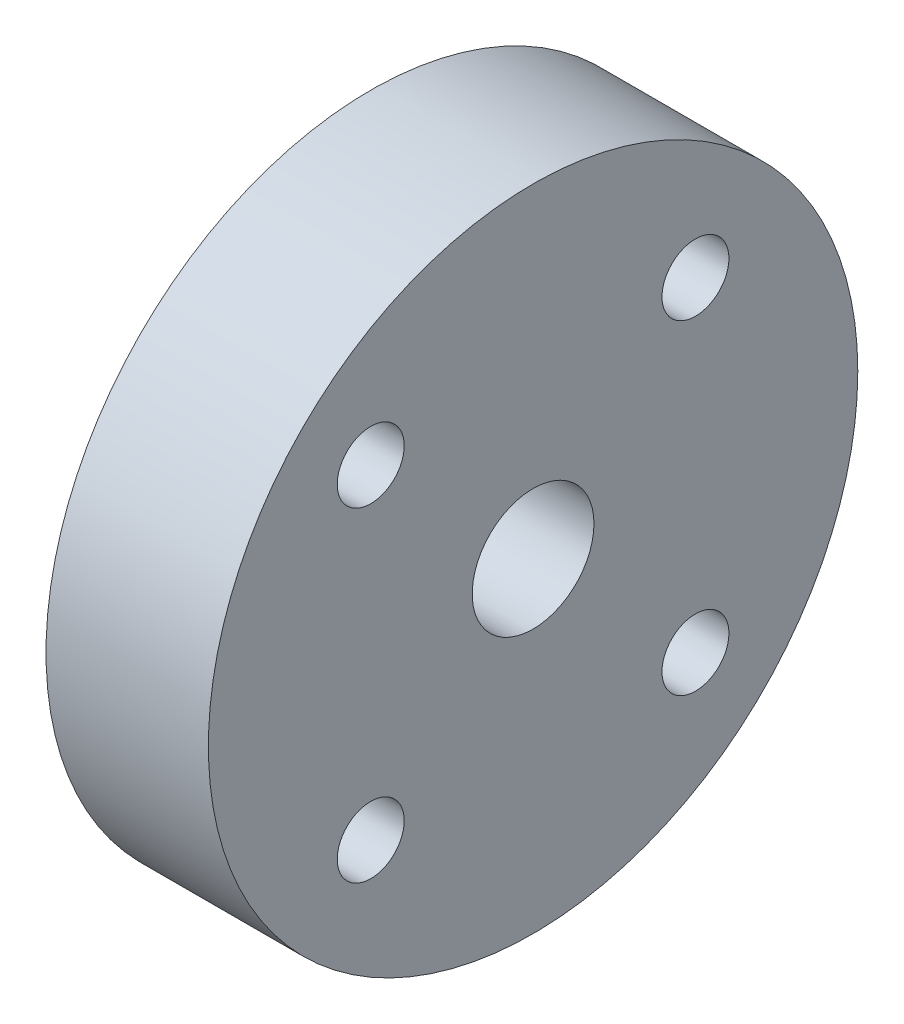
ISO-10303-21;
HEADER;
FILE_DESCRIPTION(('STEP AP214'),'2;1');
FILE_NAME('part.step','',(''),(''),'','','');
FILE_SCHEMA(('AUTOMOTIVE_DESIGN { 1 0 10303 214 1 1 1 1 }'));
ENDSEC;
DATA;
#1=APPLICATION_CONTEXT('core data for automotive mechanical design processes');
#2=APPLICATION_PROTOCOL_DEFINITION('international standard','automotive_design',2000,#1);
#3=PRODUCT_CONTEXT('',#1,'mechanical');
#4=PRODUCT('Part','Part','',(#3));
#5=PRODUCT_RELATED_PRODUCT_CATEGORY('part','',(#4));
#6=PRODUCT_DEFINITION_FORMATION('','',#4);
#7=PRODUCT_DEFINITION_CONTEXT('part definition',#1,'design');
#8=PRODUCT_DEFINITION('design','',#6,#7);
#9=PRODUCT_DEFINITION_SHAPE('','',#8);
#10=(LENGTH_UNIT() NAMED_UNIT(*) SI_UNIT(.MILLI.,.METRE.));
#11=(NAMED_UNIT(*) PLANE_ANGLE_UNIT() SI_UNIT($,.RADIAN.));
#12=(NAMED_UNIT(*) SI_UNIT($,.STERADIAN.) SOLID_ANGLE_UNIT());
#13=UNCERTAINTY_MEASURE_WITH_UNIT(LENGTH_MEASURE(1.E-05),#10,'distance_accuracy_value','');
#14=(GEOMETRIC_REPRESENTATION_CONTEXT(3) GLOBAL_UNCERTAINTY_ASSIGNED_CONTEXT((#13)) GLOBAL_UNIT_ASSIGNED_CONTEXT((#10,
#11,#12)) REPRESENTATION_CONTEXT('',''));
#15=CARTESIAN_POINT('',(0.,0.,0.));
#16=DIRECTION('',(0.,0.,1.));
#17=DIRECTION('',(1.,0.,0.));
#18=AXIS2_PLACEMENT_3D('',#15,#16,#17);
#19=CARTESIAN_POINT('',(8.,0.,0.));
#20=DIRECTION('',(-1.,0.,0.));
#21=DIRECTION('',(0.,0.,1.));
#22=AXIS2_PLACEMENT_3D('',#19,#20,#21);
#23=CYLINDRICAL_SURFACE('',#22,16.);
#24=CARTESIAN_POINT('',(8.,0.,0.));
#25=DIRECTION('',(1.,0.,0.));
#26=DIRECTION('',(0.,0.,-1.));
#27=AXIS2_PLACEMENT_3D('',#24,#25,#26);
#28=CIRCLE('',#27,16.);
#29=CARTESIAN_POINT('',(8.,0.,-16.));
#30=VERTEX_POINT('',#29);
#31=EDGE_CURVE('E10',#30,#30,#28,.T.);
#32=ORIENTED_EDGE('',*,*,#31,.F.);
#33=EDGE_LOOP('',(#32));
#34=FACE_BOUND('',#33,.T.);
#35=CARTESIAN_POINT('',(0.,0.,0.));
#36=DIRECTION('',(1.,0.,0.));
#37=DIRECTION('',(0.,0.,-1.));
#38=AXIS2_PLACEMENT_3D('',#35,#36,#37);
#39=CIRCLE('',#38,16.);
#40=CARTESIAN_POINT('',(0.,0.,-16.));
#41=VERTEX_POINT('',#40);
#42=EDGE_CURVE('E37',#41,#41,#39,.T.);
#43=ORIENTED_EDGE('',*,*,#42,.T.);
#44=EDGE_LOOP('',(#43));
#45=FACE_BOUND('',#44,.T.);
#46=ADVANCED_FACE('F40',(#34,#45),#23,.T.);
#47=CARTESIAN_POINT('',(8.,0.,0.));
#48=DIRECTION('',(1.,0.,0.));
#49=DIRECTION('',(0.,0.,-1.));
#50=AXIS2_PLACEMENT_3D('',#47,#48,#49);
#51=PLANE('',#50);
#52=CARTESIAN_POINT('',(8.,-8.,8.));
#53=DIRECTION('',(1.,0.,0.));
#54=DIRECTION('',(0.,0.,-1.));
#55=AXIS2_PLACEMENT_3D('',#52,#53,#54);
#56=CIRCLE('',#55,1.65);
#57=CARTESIAN_POINT('',(8.,-8.,6.35));
#58=VERTEX_POINT('',#57);
#59=EDGE_CURVE('E59',#58,#58,#56,.T.);
#60=ORIENTED_EDGE('',*,*,#59,.F.);
#61=EDGE_LOOP('',(#60));
#62=FACE_BOUND('',#61,.T.);
#63=CARTESIAN_POINT('',(8.,8.,-8.));
#64=DIRECTION('',(1.,0.,0.));
#65=DIRECTION('',(0.,0.,-1.));
#66=AXIS2_PLACEMENT_3D('',#63,#64,#65);
#67=CIRCLE('',#66,1.65);
#68=CARTESIAN_POINT('',(8.,8.,-9.65));
#69=VERTEX_POINT('',#68);
#70=EDGE_CURVE('E62',#69,#69,#67,.T.);
#71=ORIENTED_EDGE('',*,*,#70,.F.);
#72=EDGE_LOOP('',(#71));
#73=FACE_BOUND('',#72,.T.);
#74=CARTESIAN_POINT('',(8.,-8.,-8.));
#75=DIRECTION('',(1.,0.,0.));
#76=DIRECTION('',(0.,0.,-1.));
#77=AXIS2_PLACEMENT_3D('',#74,#75,#76);
#78=CIRCLE('',#77,1.65);
#79=CARTESIAN_POINT('',(8.,-8.,-9.65));
#80=VERTEX_POINT('',#79);
#81=EDGE_CURVE('E64',#80,#80,#78,.T.);
#82=ORIENTED_EDGE('',*,*,#81,.F.);
#83=EDGE_LOOP('',(#82));
#84=FACE_BOUND('',#83,.T.);
#85=CARTESIAN_POINT('',(8.,8.,8.));
#86=DIRECTION('',(1.,0.,0.));
#87=DIRECTION('',(0.,0.,-1.));
#88=AXIS2_PLACEMENT_3D('',#85,#86,#87);
#89=CIRCLE('',#88,1.65);
#90=CARTESIAN_POINT('',(8.,8.,6.35));
#91=VERTEX_POINT('',#90);
#92=EDGE_CURVE('E54',#91,#91,#89,.T.);
#93=ORIENTED_EDGE('',*,*,#92,.F.);
#94=EDGE_LOOP('',(#93));
#95=FACE_BOUND('',#94,.T.);
#96=CARTESIAN_POINT('',(8.,0.,0.));
#97=DIRECTION('',(1.,0.,0.));
#98=DIRECTION('',(0.,0.,-1.));
#99=AXIS2_PLACEMENT_3D('',#96,#97,#98);
#100=CIRCLE('',#99,3.);
#101=CARTESIAN_POINT('',(8.,0.,-3.));
#102=VERTEX_POINT('',#101);
#103=EDGE_CURVE('E50',#102,#102,#100,.T.);
#104=ORIENTED_EDGE('',*,*,#103,.F.);
#105=EDGE_LOOP('',(#104));
#106=FACE_BOUND('',#105,.T.);
#107=ORIENTED_EDGE('',*,*,#31,.T.);
#108=EDGE_LOOP('',(#107));
#109=FACE_BOUND('',#108,.T.);
#110=ADVANCED_FACE('F83',(#62,#73,#84,#95,#106,#109),#51,.T.);
#111=CARTESIAN_POINT('',(0.,0.,0.));
#112=DIRECTION('',(1.,0.,0.));
#113=DIRECTION('',(0.,0.,-1.));
#114=AXIS2_PLACEMENT_3D('',#111,#112,#113);
#115=PLANE('',#114);
#116=CARTESIAN_POINT('',(0.,0.,0.));
#117=DIRECTION('',(1.,0.,0.));
#118=DIRECTION('',(0.,0.,-1.));
#119=AXIS2_PLACEMENT_3D('',#116,#117,#118);
#120=CIRCLE('',#119,3.);
#121=CARTESIAN_POINT('',(0.,0.,-3.));
#122=VERTEX_POINT('',#121);
#123=EDGE_CURVE('E47',#122,#122,#120,.T.);
#124=ORIENTED_EDGE('',*,*,#123,.T.);
#125=EDGE_LOOP('',(#124));
#126=FACE_BOUND('',#125,.T.);
#127=ORIENTED_EDGE('',*,*,#42,.F.);
#128=EDGE_LOOP('',(#127));
#129=FACE_BOUND('',#128,.T.);
#130=ADVANCED_FACE('F85',(#126,#129),#115,.F.);
#131=CARTESIAN_POINT('',(8.,0.,0.));
#132=DIRECTION('',(-1.,0.,0.));
#133=DIRECTION('',(0.,0.,1.));
#134=AXIS2_PLACEMENT_3D('',#131,#132,#133);
#135=CYLINDRICAL_SURFACE('',#134,3.);
#136=ORIENTED_EDGE('',*,*,#103,.T.);
#137=EDGE_LOOP('',(#136));
#138=FACE_BOUND('',#137,.T.);
#139=ORIENTED_EDGE('',*,*,#123,.F.);
#140=EDGE_LOOP('',(#139));
#141=FACE_BOUND('',#140,.T.);
#142=ADVANCED_FACE('F93',(#138,#141),#135,.F.);
#143=CARTESIAN_POINT('',(2.,8.,8.));
#144=DIRECTION('',(1.,0.,0.));
#145=DIRECTION('',(0.,0.,-1.));
#146=AXIS2_PLACEMENT_3D('',#143,#144,#145);
#147=CYLINDRICAL_SURFACE('',#146,1.65);
#148=CARTESIAN_POINT('',(2.,8.,8.));
#149=DIRECTION('',(1.,0.,0.));
#150=DIRECTION('',(0.,0.,-1.));
#151=AXIS2_PLACEMENT_3D('',#148,#149,#150);
#152=CIRCLE('',#151,1.65);
#153=CARTESIAN_POINT('',(2.,8.,6.35));
#154=VERTEX_POINT('',#153);
#155=EDGE_CURVE('E55',#154,#154,#152,.T.);
#156=ORIENTED_EDGE('',*,*,#155,.F.);
#157=EDGE_LOOP('',(#156));
#158=FACE_BOUND('',#157,.T.);
#159=ORIENTED_EDGE('',*,*,#92,.T.);
#160=EDGE_LOOP('',(#159));
#161=FACE_BOUND('',#160,.T.);
#162=ADVANCED_FACE('F94',(#158,#161),#147,.F.);
#163=CARTESIAN_POINT('',(2.,8.,8.));
#164=DIRECTION('',(1.,0.,0.));
#165=DIRECTION('',(0.,0.,-1.));
#166=AXIS2_PLACEMENT_3D('',#163,#164,#165);
#167=PLANE('',#166);
#168=ORIENTED_EDGE('',*,*,#155,.T.);
#169=EDGE_LOOP('',(#168));
#170=FACE_BOUND('',#169,.T.);
#171=ADVANCED_FACE('F126',(#170),#167,.T.);
#172=CARTESIAN_POINT('',(2.,-8.,-8.));
#173=DIRECTION('',(1.,0.,0.));
#174=DIRECTION('',(0.,0.,-1.));
#175=AXIS2_PLACEMENT_3D('',#172,#173,#174);
#176=CYLINDRICAL_SURFACE('',#175,1.65);
#177=CARTESIAN_POINT('',(2.,-8.,-8.));
#178=DIRECTION('',(1.,0.,0.));
#179=DIRECTION('',(0.,0.,-1.));
#180=AXIS2_PLACEMENT_3D('',#177,#178,#179);
#181=CIRCLE('',#180,1.65);
#182=CARTESIAN_POINT('',(2.,-8.,-9.65));
#183=VERTEX_POINT('',#182);
#184=EDGE_CURVE('E71',#183,#183,#181,.T.);
#185=ORIENTED_EDGE('',*,*,#184,.F.);
#186=EDGE_LOOP('',(#185));
#187=FACE_BOUND('',#186,.T.);
#188=ORIENTED_EDGE('',*,*,#81,.T.);
#189=EDGE_LOOP('',(#188));
#190=FACE_BOUND('',#189,.T.);
#191=ADVANCED_FACE('F77',(#187,#190),#176,.F.);
#192=CARTESIAN_POINT('',(2.,-8.,-8.));
#193=DIRECTION('',(1.,0.,0.));
#194=DIRECTION('',(0.,0.,-1.));
#195=AXIS2_PLACEMENT_3D('',#192,#193,#194);
#196=PLANE('',#195);
#197=ORIENTED_EDGE('',*,*,#184,.T.);
#198=EDGE_LOOP('',(#197));
#199=FACE_BOUND('',#198,.T.);
#200=ADVANCED_FACE('F144',(#199),#196,.T.);
#201=CARTESIAN_POINT('',(2.,8.,-8.));
#202=DIRECTION('',(1.,0.,0.));
#203=DIRECTION('',(0.,0.,-1.));
#204=AXIS2_PLACEMENT_3D('',#201,#202,#203);
#205=CYLINDRICAL_SURFACE('',#204,1.65);
#206=CARTESIAN_POINT('',(2.,8.,-8.));
#207=DIRECTION('',(1.,0.,0.));
#208=DIRECTION('',(0.,0.,-1.));
#209=AXIS2_PLACEMENT_3D('',#206,#207,#208);
#210=CIRCLE('',#209,1.65);
#211=CARTESIAN_POINT('',(2.,8.,-9.65));
#212=VERTEX_POINT('',#211);
#213=EDGE_CURVE('E63',#212,#212,#210,.T.);
#214=ORIENTED_EDGE('',*,*,#213,.F.);
#215=EDGE_LOOP('',(#214));
#216=FACE_BOUND('',#215,.T.);
#217=ORIENTED_EDGE('',*,*,#70,.T.);
#218=EDGE_LOOP('',(#217));
#219=FACE_BOUND('',#218,.T.);
#220=ADVANCED_FACE('F152',(#216,#219),#205,.F.);
#221=CARTESIAN_POINT('',(2.,8.,-8.));
#222=DIRECTION('',(1.,0.,0.));
#223=DIRECTION('',(0.,0.,-1.));
#224=AXIS2_PLACEMENT_3D('',#221,#222,#223);
#225=PLANE('',#224);
#226=ORIENTED_EDGE('',*,*,#213,.T.);
#227=EDGE_LOOP('',(#226));
#228=FACE_BOUND('',#227,.T.);
#229=ADVANCED_FACE('F162',(#228),#225,.T.);
#230=CARTESIAN_POINT('',(2.,-8.,8.));
#231=DIRECTION('',(1.,0.,0.));
#232=DIRECTION('',(0.,0.,-1.));
#233=AXIS2_PLACEMENT_3D('',#230,#231,#232);
#234=CYLINDRICAL_SURFACE('',#233,1.65);
#235=CARTESIAN_POINT('',(2.,-8.,8.));
#236=DIRECTION('',(1.,0.,0.));
#237=DIRECTION('',(0.,0.,-1.));
#238=AXIS2_PLACEMENT_3D('',#235,#236,#237);
#239=CIRCLE('',#238,1.65);
#240=CARTESIAN_POINT('',(2.,-8.,6.35));
#241=VERTEX_POINT('',#240);
#242=EDGE_CURVE('E67',#241,#241,#239,.T.);
#243=ORIENTED_EDGE('',*,*,#242,.F.);
#244=EDGE_LOOP('',(#243));
#245=FACE_BOUND('',#244,.T.);
#246=ORIENTED_EDGE('',*,*,#59,.T.);
#247=EDGE_LOOP('',(#246));
#248=FACE_BOUND('',#247,.T.);
#249=ADVANCED_FACE('F175',(#245,#248),#234,.F.);
#250=CARTESIAN_POINT('',(2.,-8.,8.));
#251=DIRECTION('',(1.,0.,0.));
#252=DIRECTION('',(0.,0.,-1.));
#253=AXIS2_PLACEMENT_3D('',#250,#251,#252);
#254=PLANE('',#253);
#255=ORIENTED_EDGE('',*,*,#242,.T.);
#256=EDGE_LOOP('',(#255));
#257=FACE_BOUND('',#256,.T.);
#258=ADVANCED_FACE('F182',(#257),#254,.T.);
#259=CLOSED_SHELL('',(#46,#110,#130,#142,#162,#171,#191,#200,#220,#229,#249,#258));
#260=MANIFOLD_SOLID_BREP('B2',#259);
#261=ADVANCED_BREP_SHAPE_REPRESENTATION('',(#18,#260),#14);
#262=SHAPE_DEFINITION_REPRESENTATION(#9,#261);
ENDSEC;
END-ISO-10303-21;
